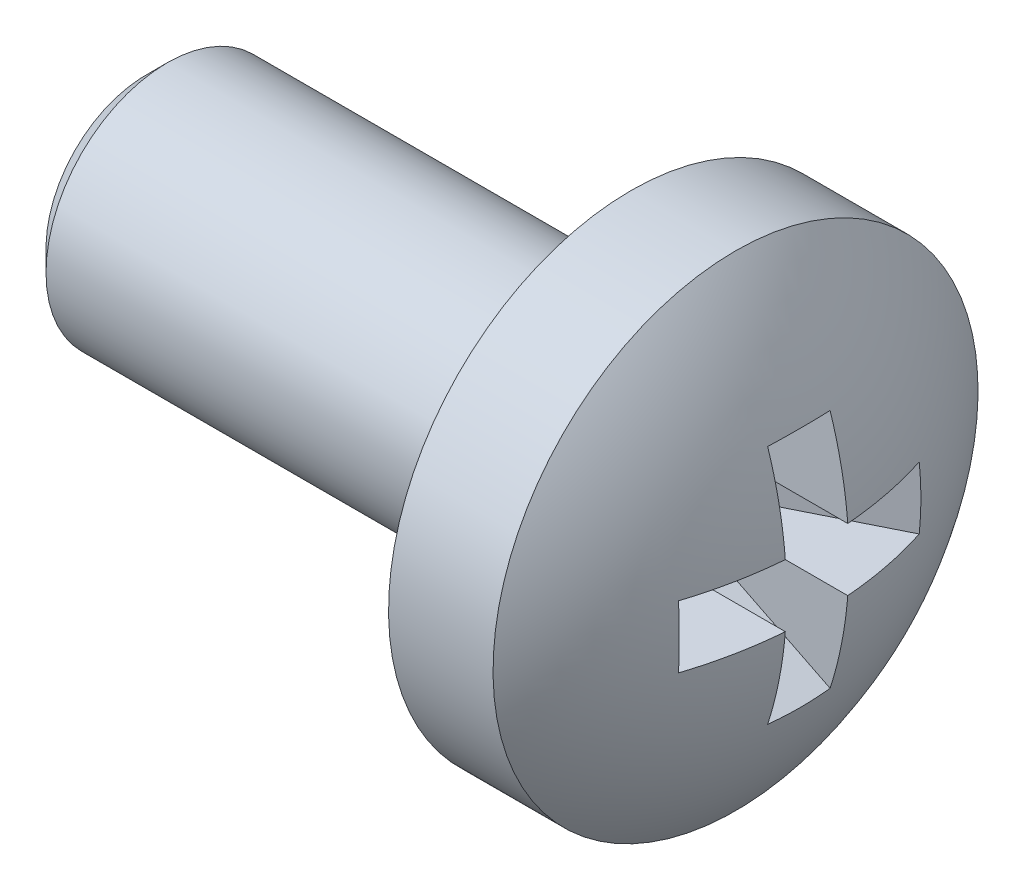
ISO-10303-21;
HEADER;
FILE_DESCRIPTION(('STEP AP214'),'2;1');
FILE_NAME('part.step','',(''),(''),'','','');
FILE_SCHEMA(('AUTOMOTIVE_DESIGN { 1 0 10303 214 1 1 1 1 }'));
ENDSEC;
DATA;
#1=APPLICATION_CONTEXT('core data for automotive mechanical design processes');
#2=APPLICATION_PROTOCOL_DEFINITION('international standard','automotive_design',2000,#1);
#3=PRODUCT_CONTEXT('',#1,'mechanical');
#4=PRODUCT('Part','Part','',(#3));
#5=PRODUCT_RELATED_PRODUCT_CATEGORY('part','',(#4));
#6=PRODUCT_DEFINITION_FORMATION('','',#4);
#7=PRODUCT_DEFINITION_CONTEXT('part definition',#1,'design');
#8=PRODUCT_DEFINITION('design','',#6,#7);
#9=PRODUCT_DEFINITION_SHAPE('','',#8);
#10=(LENGTH_UNIT() NAMED_UNIT(*) SI_UNIT(.MILLI.,.METRE.));
#11=(NAMED_UNIT(*) PLANE_ANGLE_UNIT() SI_UNIT($,.RADIAN.));
#12=(NAMED_UNIT(*) SI_UNIT($,.STERADIAN.) SOLID_ANGLE_UNIT());
#13=UNCERTAINTY_MEASURE_WITH_UNIT(LENGTH_MEASURE(1.E-05),#10,'distance_accuracy_value','');
#14=(GEOMETRIC_REPRESENTATION_CONTEXT(3) GLOBAL_UNCERTAINTY_ASSIGNED_CONTEXT((#13)) GLOBAL_UNIT_ASSIGNED_CONTEXT((#10,
#11,#12)) REPRESENTATION_CONTEXT('',''));
#15=CARTESIAN_POINT('',(0.,0.,0.));
#16=DIRECTION('',(0.,0.,1.));
#17=DIRECTION('',(1.,0.,0.));
#18=AXIS2_PLACEMENT_3D('',#15,#16,#17);
#19=CARTESIAN_POINT('',(-6.5,0.,0.));
#20=DIRECTION('',(1.,0.,0.));
#21=DIRECTION('',(0.,1.,0.));
#22=AXIS2_PLACEMENT_3D('',#19,#20,#21);
#23=SPHERICAL_SURFACE('',#22,6.5);
#24=CARTESIAN_POINT('',(-6.06443199854499,0.,-0.873614257765256));
#25=DIRECTION('',(0.446197813109809,0.,-0.894934361602025));
#26=DIRECTION('',(-0.894934361602025,0.,-0.446197813109809));
#27=AXIS2_PLACEMENT_3D('',#24,#25,#26);
#28=CIRCLE('',#27,6.42628031171515);
#29=CARTESIAN_POINT('',(-0.331830512486634,0.515,1.98455540948322));
#30=VERTEX_POINT('',#29);
#31=CARTESIAN_POINT('',(-0.331830512486634,-0.515,1.98455540948322));
#32=VERTEX_POINT('',#31);
#33=EDGE_CURVE('E195',#30,#32,#28,.T.);
#34=ORIENTED_EDGE('',*,*,#33,.F.);
#35=CARTESIAN_POINT('',(-6.5,0.515,0.));
#36=DIRECTION('',(0.,-1.,0.));
#37=DIRECTION('',(0.,0.,-1.));
#38=AXIS2_PLACEMENT_3D('',#35,#36,#37);
#39=CIRCLE('',#38,6.47956595768575);
#40=CARTESIAN_POINT('',(-0.0409327298750029,0.515,0.515));
#41=VERTEX_POINT('',#40);
#42=EDGE_CURVE('E114',#30,#41,#39,.F.);
#43=ORIENTED_EDGE('',*,*,#42,.T.);
#44=CARTESIAN_POINT('',(-6.5,0.,0.515));
#45=DIRECTION('',(0.,0.,1.));
#46=DIRECTION('',(0.,-1.,0.));
#47=AXIS2_PLACEMENT_3D('',#44,#45,#46);
#48=CIRCLE('',#47,6.47956595768575);
#49=CARTESIAN_POINT('',(-0.331830512486634,1.98455540948322,0.515));
#50=VERTEX_POINT('',#49);
#51=EDGE_CURVE('E146',#50,#41,#48,.F.);
#52=ORIENTED_EDGE('',*,*,#51,.F.);
#53=CARTESIAN_POINT('',(-6.06443199854499,-0.873614257765256,0.));
#54=DIRECTION('',(0.446197813109809,-0.894934361602025,0.));
#55=DIRECTION('',(0.894934361602025,0.446197813109809,0.));
#56=AXIS2_PLACEMENT_3D('',#53,#54,#55);
#57=CIRCLE('',#56,6.42628031171515);
#58=CARTESIAN_POINT('',(-0.331830512486634,1.98455540948322,-0.515));
#59=VERTEX_POINT('',#58);
#60=EDGE_CURVE('E143',#50,#59,#57,.F.);
#61=ORIENTED_EDGE('',*,*,#60,.T.);
#62=CARTESIAN_POINT('',(-6.5,0.,-0.515));
#63=DIRECTION('',(0.,0.,1.));
#64=DIRECTION('',(0.,-1.,0.));
#65=AXIS2_PLACEMENT_3D('',#62,#63,#64);
#66=CIRCLE('',#65,6.47956595768575);
#67=CARTESIAN_POINT('',(-0.0409327298750029,0.515,-0.515));
#68=VERTEX_POINT('',#67);
#69=EDGE_CURVE('E147',#59,#68,#66,.F.);
#70=ORIENTED_EDGE('',*,*,#69,.T.);
#71=CARTESIAN_POINT('',(-6.5,0.515,0.));
#72=DIRECTION('',(0.,-1.,0.));
#73=DIRECTION('',(0.,0.,-1.));
#74=AXIS2_PLACEMENT_3D('',#71,#72,#73);
#75=CIRCLE('',#74,6.47956595768575);
#76=CARTESIAN_POINT('',(-0.331830512486634,0.515,-1.98455540948322));
#77=VERTEX_POINT('',#76);
#78=EDGE_CURVE('E197',#68,#77,#75,.F.);
#79=ORIENTED_EDGE('',*,*,#78,.T.);
#80=CARTESIAN_POINT('',(-6.06443199854499,0.,0.873614257765255));
#81=DIRECTION('',(0.446197813109809,0.,0.894934361602025));
#82=DIRECTION('',(0.894934361602025,0.,-0.446197813109809));
#83=AXIS2_PLACEMENT_3D('',#80,#81,#82);
#84=CIRCLE('',#83,6.42628031171515);
#85=CARTESIAN_POINT('',(-0.331830512486634,-0.515,-1.98455540948322));
#86=VERTEX_POINT('',#85);
#87=EDGE_CURVE('E200',#77,#86,#84,.F.);
#88=ORIENTED_EDGE('',*,*,#87,.T.);
#89=CARTESIAN_POINT('',(-6.5,-0.515,0.));
#90=DIRECTION('',(0.,-1.,0.));
#91=DIRECTION('',(0.,0.,-1.));
#92=AXIS2_PLACEMENT_3D('',#89,#90,#91);
#93=CIRCLE('',#92,6.47956595768575);
#94=CARTESIAN_POINT('',(-0.0409327298750029,-0.515,-0.515));
#95=VERTEX_POINT('',#94);
#96=EDGE_CURVE('E201',#95,#86,#93,.F.);
#97=ORIENTED_EDGE('',*,*,#96,.F.);
#98=CARTESIAN_POINT('',(-6.5,0.,-0.515));
#99=DIRECTION('',(0.,0.,1.));
#100=DIRECTION('',(0.,-1.,0.));
#101=AXIS2_PLACEMENT_3D('',#98,#99,#100);
#102=CIRCLE('',#101,6.47956595768575);
#103=CARTESIAN_POINT('',(-0.331830512486634,-1.98455540948322,-0.515));
#104=VERTEX_POINT('',#103);
#105=EDGE_CURVE('E157',#95,#104,#102,.F.);
#106=ORIENTED_EDGE('',*,*,#105,.T.);
#107=CARTESIAN_POINT('',(-6.06443199854499,0.873614257765256,0.));
#108=DIRECTION('',(0.446197813109809,0.894934361602025,0.));
#109=DIRECTION('',(-0.894934361602025,0.446197813109809,0.));
#110=AXIS2_PLACEMENT_3D('',#107,#108,#109);
#111=CIRCLE('',#110,6.42628031171515);
#112=CARTESIAN_POINT('',(-0.331830512486634,-1.98455540948322,0.515));
#113=VERTEX_POINT('',#112);
#114=EDGE_CURVE('E154',#113,#104,#111,.T.);
#115=ORIENTED_EDGE('',*,*,#114,.F.);
#116=CARTESIAN_POINT('',(-6.5,0.,0.515));
#117=DIRECTION('',(0.,0.,1.));
#118=DIRECTION('',(0.,-1.,0.));
#119=AXIS2_PLACEMENT_3D('',#116,#117,#118);
#120=CIRCLE('',#119,6.47956595768575);
#121=CARTESIAN_POINT('',(-0.0409327298750029,-0.515,0.515));
#122=VERTEX_POINT('',#121);
#123=EDGE_CURVE('E158',#122,#113,#120,.F.);
#124=ORIENTED_EDGE('',*,*,#123,.F.);
#125=CARTESIAN_POINT('',(-6.5,-0.515,0.));
#126=DIRECTION('',(0.,-1.,0.));
#127=DIRECTION('',(0.,0.,-1.));
#128=AXIS2_PLACEMENT_3D('',#125,#126,#127);
#129=CIRCLE('',#128,6.47956595768575);
#130=EDGE_CURVE('E193',#32,#122,#129,.F.);
#131=ORIENTED_EDGE('',*,*,#130,.F.);
#132=EDGE_LOOP('',(#34,#43,#52,#61,#70,#79,#88,#97,#106,#115,#124,#131));
#133=FACE_BOUND('',#132,.T.);
#134=CARTESIAN_POINT('',(-1.3765246170202,0.,0.));
#135=DIRECTION('',(1.,0.,0.));
#136=DIRECTION('',(0.,1.,0.));
#137=AXIS2_PLACEMENT_3D('',#134,#135,#136);
#138=CIRCLE('',#137,4.);
#139=CARTESIAN_POINT('',(-1.3765246170202,4.,0.));
#140=VERTEX_POINT('',#139);
#141=EDGE_CURVE('E118',#140,#140,#138,.T.);
#142=ORIENTED_EDGE('',*,*,#141,.T.);
#143=EDGE_LOOP('',(#142));
#144=FACE_BOUND('',#143,.T.);
#145=ADVANCED_FACE('F16',(#133,#144),#23,.T.);
#146=CARTESIAN_POINT('',(-11.1,0.,0.));
#147=DIRECTION('',(-1.,0.,0.));
#148=DIRECTION('',(0.,-1.,0.));
#149=AXIS2_PLACEMENT_3D('',#146,#147,#148);
#150=PLANE('',#149);
#151=CARTESIAN_POINT('',(-11.1,0.,0.));
#152=DIRECTION('',(-1.,0.,0.));
#153=DIRECTION('',(0.,-1.,0.));
#154=AXIS2_PLACEMENT_3D('',#151,#152,#153);
#155=CIRCLE('',#154,1.65);
#156=CARTESIAN_POINT('',(-11.1,-1.65,0.));
#157=VERTEX_POINT('',#156);
#158=EDGE_CURVE('E11',#157,#157,#155,.T.);
#159=ORIENTED_EDGE('',*,*,#158,.T.);
#160=EDGE_LOOP('',(#159));
#161=FACE_BOUND('',#160,.T.);
#162=ADVANCED_FACE('F262',(#161),#150,.T.);
#163=CARTESIAN_POINT('',(0.,0.,0.));
#164=DIRECTION('',(1.,0.,0.));
#165=DIRECTION('',(0.,1.,0.));
#166=AXIS2_PLACEMENT_3D('',#163,#164,#165);
#167=CYLINDRICAL_SURFACE('',#166,2.);
#168=CARTESIAN_POINT('',(-10.75,0.,0.));
#169=DIRECTION('',(-1.,0.,0.));
#170=DIRECTION('',(0.,-1.,0.));
#171=AXIS2_PLACEMENT_3D('',#168,#169,#170);
#172=CIRCLE('',#171,2.);
#173=CARTESIAN_POINT('',(-10.75,-2.,0.));
#174=VERTEX_POINT('',#173);
#175=EDGE_CURVE('E26',#174,#174,#172,.F.);
#176=ORIENTED_EDGE('',*,*,#175,.T.);
#177=EDGE_LOOP('',(#176));
#178=FACE_BOUND('',#177,.T.);
#179=CARTESIAN_POINT('',(-3.1,0.,0.));
#180=DIRECTION('',(1.,0.,0.));
#181=DIRECTION('',(0.,1.,0.));
#182=AXIS2_PLACEMENT_3D('',#179,#180,#181);
#183=CIRCLE('',#182,2.);
#184=CARTESIAN_POINT('',(-3.1,2.,0.));
#185=VERTEX_POINT('',#184);
#186=EDGE_CURVE('E190',#185,#185,#183,.T.);
#187=ORIENTED_EDGE('',*,*,#186,.F.);
#188=EDGE_LOOP('',(#187));
#189=FACE_BOUND('',#188,.T.);
#190=ADVANCED_FACE('F268',(#178,#189),#167,.T.);
#191=CARTESIAN_POINT('',(-3.1,2.,0.));
#192=DIRECTION('',(-1.,0.,0.));
#193=DIRECTION('',(0.,-1.,0.));
#194=AXIS2_PLACEMENT_3D('',#191,#192,#193);
#195=PLANE('',#194);
#196=ORIENTED_EDGE('',*,*,#186,.T.);
#197=EDGE_LOOP('',(#196));
#198=FACE_BOUND('',#197,.T.);
#199=CARTESIAN_POINT('',(-3.1,0.,0.));
#200=DIRECTION('',(1.,0.,0.));
#201=DIRECTION('',(0.,1.,0.));
#202=AXIS2_PLACEMENT_3D('',#199,#200,#201);
#203=CIRCLE('',#202,4.);
#204=CARTESIAN_POINT('',(-3.1,4.,0.));
#205=VERTEX_POINT('',#204);
#206=EDGE_CURVE('E187',#205,#205,#203,.T.);
#207=ORIENTED_EDGE('',*,*,#206,.F.);
#208=EDGE_LOOP('',(#207));
#209=FACE_BOUND('',#208,.T.);
#210=ADVANCED_FACE('F299',(#198,#209),#195,.T.);
#211=CARTESIAN_POINT('',(0.,0.,0.));
#212=DIRECTION('',(1.,0.,0.));
#213=DIRECTION('',(0.,1.,0.));
#214=AXIS2_PLACEMENT_3D('',#211,#212,#213);
#215=CYLINDRICAL_SURFACE('',#214,4.);
#216=ORIENTED_EDGE('',*,*,#206,.T.);
#217=EDGE_LOOP('',(#216));
#218=FACE_BOUND('',#217,.T.);
#219=ORIENTED_EDGE('',*,*,#141,.F.);
#220=EDGE_LOOP('',(#219));
#221=FACE_BOUND('',#220,.T.);
#222=ADVANCED_FACE('F296',(#218,#221),#215,.T.);
#223=CARTESIAN_POINT('',(0.,0.,2.15));
#224=DIRECTION('',(0.446197813109809,0.,-0.894934361602025));
#225=DIRECTION('',(-0.894934361602025,0.,-0.446197813109809));
#226=AXIS2_PLACEMENT_3D('',#223,#224,#225);
#227=PLANE('',#226);
#228=ORIENTED_EDGE('',*,*,#33,.T.);
#229=DIRECTION('',(-0.894934361602025,0.,-0.44619781310981));
#230=VECTOR('',#229,1.);
#231=CARTESIAN_POINT('',(0.,-0.515,2.15));
#232=LINE('',#231,#230);
#233=CARTESIAN_POINT('',(-2.34,-0.515,0.983319037154967));
#234=VERTEX_POINT('',#233);
#235=EDGE_CURVE('E35',#234,#32,#232,.F.);
#236=ORIENTED_EDGE('',*,*,#235,.F.);
#237=DIRECTION('',(0.,1.,0.));
#238=VECTOR('',#237,1.);
#239=CARTESIAN_POINT('',(-2.34,0.,0.983319037154967));
#240=LINE('',#239,#238);
#241=CARTESIAN_POINT('',(-2.34,0.515,0.983319037154967));
#242=VERTEX_POINT('',#241);
#243=EDGE_CURVE('E126',#242,#234,#240,.F.);
#244=ORIENTED_EDGE('',*,*,#243,.F.);
#245=DIRECTION('',(-0.894934361602025,0.,-0.44619781310981));
#246=VECTOR('',#245,1.);
#247=CARTESIAN_POINT('',(0.,0.515,2.15));
#248=LINE('',#247,#246);
#249=EDGE_CURVE('E107',#242,#30,#248,.F.);
#250=ORIENTED_EDGE('',*,*,#249,.T.);
#251=EDGE_LOOP('',(#228,#236,#244,#250));
#252=FACE_BOUND('',#251,.T.);
#253=ADVANCED_FACE('F18',(#252),#227,.T.);
#254=CARTESIAN_POINT('',(-2.34,0.515,0.));
#255=DIRECTION('',(0.,-1.,0.));
#256=DIRECTION('',(0.,0.,-1.));
#257=AXIS2_PLACEMENT_3D('',#254,#255,#256);
#258=PLANE('',#257);
#259=ORIENTED_EDGE('',*,*,#249,.F.);
#260=DIRECTION('',(0.,0.,-1.));
#261=VECTOR('',#260,1.);
#262=CARTESIAN_POINT('',(-2.34,0.515,0.));
#263=LINE('',#262,#261);
#264=CARTESIAN_POINT('',(-2.34,0.515,0.515));
#265=VERTEX_POINT('',#264);
#266=EDGE_CURVE('E111',#242,#265,#263,.T.);
#267=ORIENTED_EDGE('',*,*,#266,.T.);
#268=DIRECTION('',(1.,0.,0.));
#269=VECTOR('',#268,1.);
#270=CARTESIAN_POINT('',(-2.34,0.515,0.515));
#271=LINE('',#270,#269);
#272=EDGE_CURVE('E119',#265,#41,#271,.T.);
#273=ORIENTED_EDGE('',*,*,#272,.T.);
#274=ORIENTED_EDGE('',*,*,#42,.F.);
#275=EDGE_LOOP('',(#259,#267,#273,#274));
#276=FACE_BOUND('',#275,.T.);
#277=ADVANCED_FACE('F109',(#276),#258,.T.);
#278=CARTESIAN_POINT('',(-2.34,0.,0.515));
#279=DIRECTION('',(0.,0.,1.));
#280=DIRECTION('',(0.,-1.,0.));
#281=AXIS2_PLACEMENT_3D('',#278,#279,#280);
#282=PLANE('',#281);
#283=ORIENTED_EDGE('',*,*,#51,.T.);
#284=ORIENTED_EDGE('',*,*,#272,.F.);
#285=DIRECTION('',(0.,-1.,0.));
#286=VECTOR('',#285,1.);
#287=CARTESIAN_POINT('',(-2.34,0.,0.515));
#288=LINE('',#287,#286);
#289=CARTESIAN_POINT('',(-2.34,0.983319037154967,0.515));
#290=VERTEX_POINT('',#289);
#291=EDGE_CURVE('E129',#290,#265,#288,.T.);
#292=ORIENTED_EDGE('',*,*,#291,.F.);
#293=DIRECTION('',(0.894934361602025,0.44619781310981,0.));
#294=VECTOR('',#293,1.);
#295=CARTESIAN_POINT('',(-2.73265675038874,0.787547603133116,0.515));
#296=LINE('',#295,#294);
#297=EDGE_CURVE('E139',#290,#50,#296,.T.);
#298=ORIENTED_EDGE('',*,*,#297,.T.);
#299=EDGE_LOOP('',(#283,#284,#292,#298));
#300=FACE_BOUND('',#299,.T.);
#301=ADVANCED_FACE('F250',(#300),#282,.F.);
#302=CARTESIAN_POINT('',(0.,2.15,0.));
#303=DIRECTION('',(0.446197813109809,-0.894934361602025,0.));
#304=DIRECTION('',(0.894934361602025,0.446197813109809,0.));
#305=AXIS2_PLACEMENT_3D('',#302,#303,#304);
#306=PLANE('',#305);
#307=ORIENTED_EDGE('',*,*,#297,.F.);
#308=DIRECTION('',(0.,0.,-1.));
#309=VECTOR('',#308,1.);
#310=CARTESIAN_POINT('',(-2.34,0.983319037154967,0.));
#311=LINE('',#310,#309);
#312=CARTESIAN_POINT('',(-2.34,0.983319037154967,-0.515));
#313=VERTEX_POINT('',#312);
#314=EDGE_CURVE('E151',#290,#313,#311,.T.);
#315=ORIENTED_EDGE('',*,*,#314,.T.);
#316=DIRECTION('',(0.894934361602025,0.44619781310981,0.));
#317=VECTOR('',#316,1.);
#318=CARTESIAN_POINT('',(-2.73265675038874,0.787547603133116,-0.515));
#319=LINE('',#318,#317);
#320=EDGE_CURVE('E142',#313,#59,#319,.T.);
#321=ORIENTED_EDGE('',*,*,#320,.T.);
#322=ORIENTED_EDGE('',*,*,#60,.F.);
#323=EDGE_LOOP('',(#307,#315,#321,#322));
#324=FACE_BOUND('',#323,.T.);
#325=ADVANCED_FACE('F248',(#324),#306,.T.);
#326=CARTESIAN_POINT('',(-2.34,0.,-0.515));
#327=DIRECTION('',(0.,0.,1.));
#328=DIRECTION('',(0.,-1.,0.));
#329=AXIS2_PLACEMENT_3D('',#326,#327,#328);
#330=PLANE('',#329);
#331=ORIENTED_EDGE('',*,*,#320,.F.);
#332=DIRECTION('',(0.,-1.,0.));
#333=VECTOR('',#332,1.);
#334=CARTESIAN_POINT('',(-2.34,0.,-0.515));
#335=LINE('',#334,#333);
#336=CARTESIAN_POINT('',(-2.34,0.515,-0.515));
#337=VERTEX_POINT('',#336);
#338=EDGE_CURVE('E153',#313,#337,#335,.T.);
#339=ORIENTED_EDGE('',*,*,#338,.T.);
#340=DIRECTION('',(1.,0.,0.));
#341=VECTOR('',#340,1.);
#342=CARTESIAN_POINT('',(-2.34,0.515,-0.515));
#343=LINE('',#342,#341);
#344=EDGE_CURVE('E150',#337,#68,#343,.T.);
#345=ORIENTED_EDGE('',*,*,#344,.T.);
#346=ORIENTED_EDGE('',*,*,#69,.F.);
#347=EDGE_LOOP('',(#331,#339,#345,#346));
#348=FACE_BOUND('',#347,.T.);
#349=ADVANCED_FACE('F245',(#348),#330,.T.);
#350=CARTESIAN_POINT('',(-2.34,0.515,0.));
#351=DIRECTION('',(0.,-1.,0.));
#352=DIRECTION('',(0.,0.,-1.));
#353=AXIS2_PLACEMENT_3D('',#350,#351,#352);
#354=PLANE('',#353);
#355=ORIENTED_EDGE('',*,*,#344,.F.);
#356=DIRECTION('',(0.,0.,-1.));
#357=VECTOR('',#356,1.);
#358=CARTESIAN_POINT('',(-2.34,0.515,0.));
#359=LINE('',#358,#357);
#360=CARTESIAN_POINT('',(-2.34,0.515,-0.983319037154968));
#361=VERTEX_POINT('',#360);
#362=EDGE_CURVE('E173',#337,#361,#359,.T.);
#363=ORIENTED_EDGE('',*,*,#362,.T.);
#364=DIRECTION('',(0.894934361602025,0.,-0.44619781310981));
#365=VECTOR('',#364,1.);
#366=CARTESIAN_POINT('',(0.,0.515,-2.15));
#367=LINE('',#366,#365);
#368=EDGE_CURVE('E180',#361,#77,#367,.T.);
#369=ORIENTED_EDGE('',*,*,#368,.T.);
#370=ORIENTED_EDGE('',*,*,#78,.F.);
#371=EDGE_LOOP('',(#355,#363,#369,#370));
#372=FACE_BOUND('',#371,.T.);
#373=ADVANCED_FACE('F242',(#372),#354,.T.);
#374=CARTESIAN_POINT('',(0.,0.,-2.15));
#375=DIRECTION('',(0.446197813109809,0.,0.894934361602025));
#376=DIRECTION('',(0.894934361602025,0.,-0.446197813109809));
#377=AXIS2_PLACEMENT_3D('',#374,#375,#376);
#378=PLANE('',#377);
#379=ORIENTED_EDGE('',*,*,#368,.F.);
#380=DIRECTION('',(0.,-1.,0.));
#381=VECTOR('',#380,1.);
#382=CARTESIAN_POINT('',(-2.34,0.,-0.983319037154968));
#383=LINE('',#382,#381);
#384=CARTESIAN_POINT('',(-2.34,-0.515,-0.983319037154968));
#385=VERTEX_POINT('',#384);
#386=EDGE_CURVE('E172',#361,#385,#383,.T.);
#387=ORIENTED_EDGE('',*,*,#386,.T.);
#388=DIRECTION('',(0.894934361602025,0.,-0.44619781310981));
#389=VECTOR('',#388,1.);
#390=CARTESIAN_POINT('',(0.,-0.515,-2.15));
#391=LINE('',#390,#389);
#392=EDGE_CURVE('E182',#385,#86,#391,.T.);
#393=ORIENTED_EDGE('',*,*,#392,.T.);
#394=ORIENTED_EDGE('',*,*,#87,.F.);
#395=EDGE_LOOP('',(#379,#387,#393,#394));
#396=FACE_BOUND('',#395,.T.);
#397=ADVANCED_FACE('F236',(#396),#378,.T.);
#398=CARTESIAN_POINT('',(-2.34,-0.515,0.));
#399=DIRECTION('',(0.,-1.,0.));
#400=DIRECTION('',(0.,0.,-1.));
#401=AXIS2_PLACEMENT_3D('',#398,#399,#400);
#402=PLANE('',#401);
#403=ORIENTED_EDGE('',*,*,#96,.T.);
#404=ORIENTED_EDGE('',*,*,#392,.F.);
#405=DIRECTION('',(0.,0.,-1.));
#406=VECTOR('',#405,1.);
#407=CARTESIAN_POINT('',(-2.34,-0.515,0.));
#408=LINE('',#407,#406);
#409=CARTESIAN_POINT('',(-2.34,-0.515,-0.515));
#410=VERTEX_POINT('',#409);
#411=EDGE_CURVE('E165',#410,#385,#408,.T.);
#412=ORIENTED_EDGE('',*,*,#411,.F.);
#413=DIRECTION('',(1.,0.,0.));
#414=VECTOR('',#413,1.);
#415=CARTESIAN_POINT('',(-2.34,-0.515,-0.515));
#416=LINE('',#415,#414);
#417=EDGE_CURVE('E79',#410,#95,#416,.T.);
#418=ORIENTED_EDGE('',*,*,#417,.T.);
#419=EDGE_LOOP('',(#403,#404,#412,#418));
#420=FACE_BOUND('',#419,.T.);
#421=ADVANCED_FACE('F232',(#420),#402,.F.);
#422=CARTESIAN_POINT('',(-2.34,0.,-0.515));
#423=DIRECTION('',(0.,0.,1.));
#424=DIRECTION('',(0.,-1.,0.));
#425=AXIS2_PLACEMENT_3D('',#422,#423,#424);
#426=PLANE('',#425);
#427=ORIENTED_EDGE('',*,*,#417,.F.);
#428=DIRECTION('',(0.,-1.,0.));
#429=VECTOR('',#428,1.);
#430=CARTESIAN_POINT('',(-2.34,0.,-0.515));
#431=LINE('',#430,#429);
#432=CARTESIAN_POINT('',(-2.34,-0.983319037154967,-0.515));
#433=VERTEX_POINT('',#432);
#434=EDGE_CURVE('E73',#410,#433,#431,.T.);
#435=ORIENTED_EDGE('',*,*,#434,.T.);
#436=DIRECTION('',(-0.894934361602025,0.44619781310981,0.));
#437=VECTOR('',#436,1.);
#438=CARTESIAN_POINT('',(-2.73265675038874,-0.787547603133116,-0.515));
#439=LINE('',#438,#437);
#440=EDGE_CURVE('E20',#433,#104,#439,.F.);
#441=ORIENTED_EDGE('',*,*,#440,.T.);
#442=ORIENTED_EDGE('',*,*,#105,.F.);
#443=EDGE_LOOP('',(#427,#435,#441,#442));
#444=FACE_BOUND('',#443,.T.);
#445=ADVANCED_FACE('F228',(#444),#426,.T.);
#446=CARTESIAN_POINT('',(0.,-2.15,0.));
#447=DIRECTION('',(0.446197813109809,0.894934361602025,0.));
#448=DIRECTION('',(-0.894934361602025,0.446197813109809,0.));
#449=AXIS2_PLACEMENT_3D('',#446,#447,#448);
#450=PLANE('',#449);
#451=ORIENTED_EDGE('',*,*,#114,.T.);
#452=ORIENTED_EDGE('',*,*,#440,.F.);
#453=DIRECTION('',(0.,0.,1.));
#454=VECTOR('',#453,1.);
#455=CARTESIAN_POINT('',(-2.34,-0.983319037154967,0.));
#456=LINE('',#455,#454);
#457=CARTESIAN_POINT('',(-2.34,-0.983319037154967,0.515));
#458=VERTEX_POINT('',#457);
#459=EDGE_CURVE('E161',#458,#433,#456,.F.);
#460=ORIENTED_EDGE('',*,*,#459,.F.);
#461=DIRECTION('',(-0.894934361602025,0.44619781310981,0.));
#462=VECTOR('',#461,1.);
#463=CARTESIAN_POINT('',(-2.73265675038874,-0.787547603133116,0.515));
#464=LINE('',#463,#462);
#465=EDGE_CURVE('E159',#458,#113,#464,.F.);
#466=ORIENTED_EDGE('',*,*,#465,.T.);
#467=EDGE_LOOP('',(#451,#452,#460,#466));
#468=FACE_BOUND('',#467,.T.);
#469=ADVANCED_FACE('F227',(#468),#450,.T.);
#470=CARTESIAN_POINT('',(-2.34,0.,0.515));
#471=DIRECTION('',(0.,0.,1.));
#472=DIRECTION('',(0.,-1.,0.));
#473=AXIS2_PLACEMENT_3D('',#470,#471,#472);
#474=PLANE('',#473);
#475=ORIENTED_EDGE('',*,*,#123,.T.);
#476=ORIENTED_EDGE('',*,*,#465,.F.);
#477=DIRECTION('',(0.,-1.,0.));
#478=VECTOR('',#477,1.);
#479=CARTESIAN_POINT('',(-2.34,0.,0.515));
#480=LINE('',#479,#478);
#481=CARTESIAN_POINT('',(-2.34,-0.515,0.515));
#482=VERTEX_POINT('',#481);
#483=EDGE_CURVE('E133',#482,#458,#480,.T.);
#484=ORIENTED_EDGE('',*,*,#483,.F.);
#485=DIRECTION('',(1.,0.,0.));
#486=VECTOR('',#485,1.);
#487=CARTESIAN_POINT('',(-2.34,-0.515,0.515));
#488=LINE('',#487,#486);
#489=EDGE_CURVE('E138',#482,#122,#488,.T.);
#490=ORIENTED_EDGE('',*,*,#489,.T.);
#491=EDGE_LOOP('',(#475,#476,#484,#490));
#492=FACE_BOUND('',#491,.T.);
#493=ADVANCED_FACE('F225',(#492),#474,.F.);
#494=CARTESIAN_POINT('',(-2.34,-0.515,0.));
#495=DIRECTION('',(0.,-1.,0.));
#496=DIRECTION('',(0.,0.,-1.));
#497=AXIS2_PLACEMENT_3D('',#494,#495,#496);
#498=PLANE('',#497);
#499=ORIENTED_EDGE('',*,*,#130,.T.);
#500=ORIENTED_EDGE('',*,*,#489,.F.);
#501=DIRECTION('',(0.,0.,-1.));
#502=VECTOR('',#501,1.);
#503=CARTESIAN_POINT('',(-2.34,-0.515,0.));
#504=LINE('',#503,#502);
#505=EDGE_CURVE('E131',#234,#482,#504,.T.);
#506=ORIENTED_EDGE('',*,*,#505,.F.);
#507=ORIENTED_EDGE('',*,*,#235,.T.);
#508=EDGE_LOOP('',(#499,#500,#506,#507));
#509=FACE_BOUND('',#508,.T.);
#510=ADVANCED_FACE('F223',(#509),#498,.F.);
#511=CARTESIAN_POINT('',(-2.34,0.,0.));
#512=DIRECTION('',(1.,0.,0.));
#513=DIRECTION('',(0.,0.,-1.));
#514=AXIS2_PLACEMENT_3D('',#511,#512,#513);
#515=PLANE('',#514);
#516=ORIENTED_EDGE('',*,*,#243,.T.);
#517=ORIENTED_EDGE('',*,*,#505,.T.);
#518=ORIENTED_EDGE('',*,*,#483,.T.);
#519=ORIENTED_EDGE('',*,*,#459,.T.);
#520=ORIENTED_EDGE('',*,*,#434,.F.);
#521=ORIENTED_EDGE('',*,*,#411,.T.);
#522=ORIENTED_EDGE('',*,*,#386,.F.);
#523=ORIENTED_EDGE('',*,*,#362,.F.);
#524=ORIENTED_EDGE('',*,*,#338,.F.);
#525=ORIENTED_EDGE('',*,*,#314,.F.);
#526=ORIENTED_EDGE('',*,*,#291,.T.);
#527=ORIENTED_EDGE('',*,*,#266,.F.);
#528=EDGE_LOOP('',(#516,#517,#518,#519,#520,#521,#522,#523,#524,#525,#526,#527));
#529=FACE_BOUND('',#528,.T.);
#530=ADVANCED_FACE('F124',(#529),#515,.T.);
#531=CARTESIAN_POINT('',(-10.75,0.,0.));
#532=DIRECTION('',(1.,0.,0.));
#533=DIRECTION('',(0.,1.,0.));
#534=AXIS2_PLACEMENT_3D('',#531,#532,#533);
#535=CONICAL_SURFACE('',#534,2.,0.785398163397452);
#536=ORIENTED_EDGE('',*,*,#158,.F.);
#537=EDGE_LOOP('',(#536));
#538=FACE_BOUND('',#537,.T.);
#539=ORIENTED_EDGE('',*,*,#175,.F.);
#540=EDGE_LOOP('',(#539));
#541=FACE_BOUND('',#540,.T.);
#542=ADVANCED_FACE('F273',(#538,#541),#535,.T.);
#543=CLOSED_SHELL('',(#145,#162,#190,#210,#222,#253,#277,#301,#325,#349,#373,#397,#421,#445,
#469,#493,#510,#530,#542));
#544=MANIFOLD_SOLID_BREP('B1',#543);
#545=ADVANCED_BREP_SHAPE_REPRESENTATION('',(#18,#544),#14);
#546=SHAPE_DEFINITION_REPRESENTATION(#9,#545);
ENDSEC;
END-ISO-10303-21;
